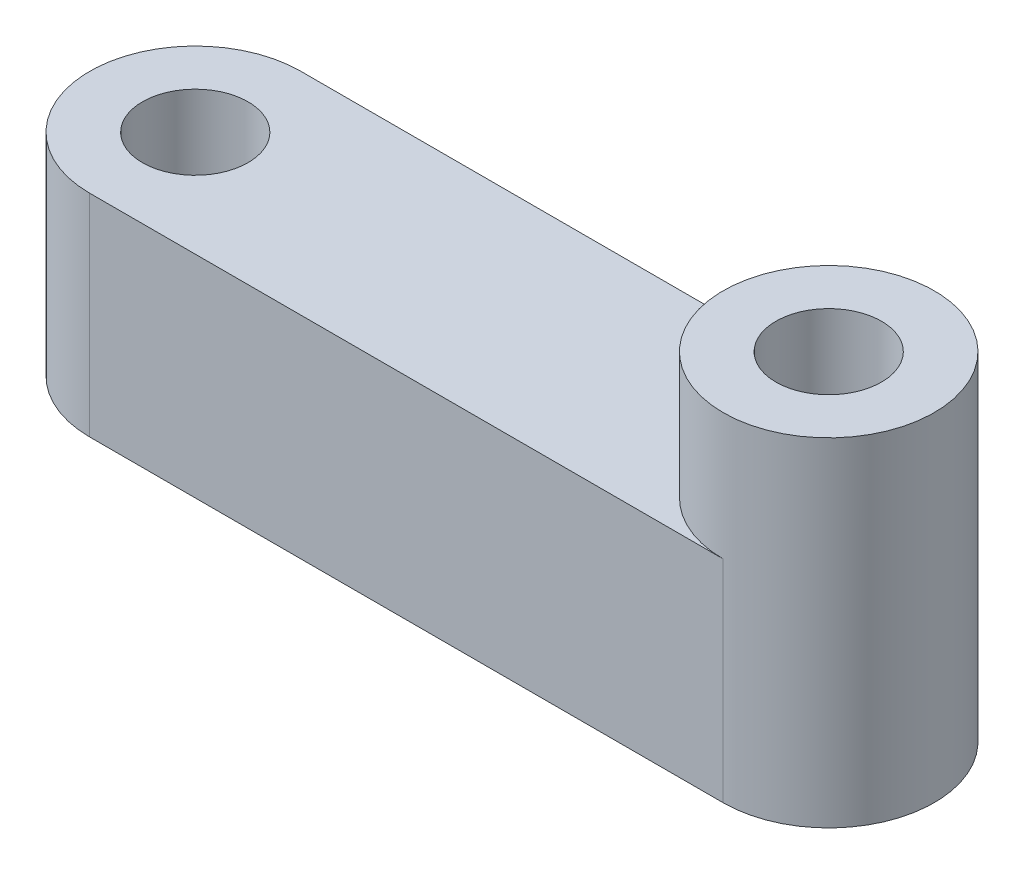
ISO-10303-21;
HEADER;
FILE_DESCRIPTION(('STEP AP214'),'2;1');
FILE_NAME('part.step','',(''),(''),'','','');
FILE_SCHEMA(('AUTOMOTIVE_DESIGN { 1 0 10303 214 1 1 1 1 }'));
ENDSEC;
DATA;
#1=APPLICATION_CONTEXT('core data for automotive mechanical design processes');
#2=APPLICATION_PROTOCOL_DEFINITION('international standard','automotive_design',2000,#1);
#3=PRODUCT_CONTEXT('',#1,'mechanical');
#4=PRODUCT('Part','Part','',(#3));
#5=PRODUCT_RELATED_PRODUCT_CATEGORY('part','',(#4));
#6=PRODUCT_DEFINITION_FORMATION('','',#4);
#7=PRODUCT_DEFINITION_CONTEXT('part definition',#1,'design');
#8=PRODUCT_DEFINITION('design','',#6,#7);
#9=PRODUCT_DEFINITION_SHAPE('','',#8);
#10=(LENGTH_UNIT() NAMED_UNIT(*) SI_UNIT(.MILLI.,.METRE.));
#11=(NAMED_UNIT(*) PLANE_ANGLE_UNIT() SI_UNIT($,.RADIAN.));
#12=(NAMED_UNIT(*) SI_UNIT($,.STERADIAN.) SOLID_ANGLE_UNIT());
#13=UNCERTAINTY_MEASURE_WITH_UNIT(LENGTH_MEASURE(1.E-05),#10,'distance_accuracy_value','');
#14=(GEOMETRIC_REPRESENTATION_CONTEXT(3) GLOBAL_UNCERTAINTY_ASSIGNED_CONTEXT((#13)) GLOBAL_UNIT_ASSIGNED_CONTEXT((#10,
#11,#12)) REPRESENTATION_CONTEXT('',''));
#15=CARTESIAN_POINT('',(0.,0.,0.));
#16=DIRECTION('',(0.,0.,1.));
#17=DIRECTION('',(1.,0.,0.));
#18=AXIS2_PLACEMENT_3D('',#15,#16,#17);
#19=CARTESIAN_POINT('',(0.,-6.,0.));
#20=DIRECTION('',(0.,1.,0.));
#21=DIRECTION('',(0.,0.,1.));
#22=AXIS2_PLACEMENT_3D('',#19,#20,#21);
#23=CYLINDRICAL_SURFACE('',#22,5.);
#24=DIRECTION('',(0.,1.,0.));
#25=VECTOR('',#24,1.);
#26=CARTESIAN_POINT('',(0.,-6.,5.));
#27=LINE('',#26,#25);
#28=CARTESIAN_POINT('',(0.,-6.,5.));
#29=VERTEX_POINT('',#28);
#30=CARTESIAN_POINT('',(0.,4.,5.));
#31=VERTEX_POINT('',#30);
#32=EDGE_CURVE('E92',#29,#31,#27,.T.);
#33=ORIENTED_EDGE('',*,*,#32,.T.);
#34=CARTESIAN_POINT('',(0.,4.,0.));
#35=DIRECTION('',(0.,1.,0.));
#36=DIRECTION('',(0.,0.,1.));
#37=AXIS2_PLACEMENT_3D('',#34,#35,#36);
#38=CIRCLE('',#37,5.);
#39=CARTESIAN_POINT('',(0.,4.,-5.));
#40=VERTEX_POINT('',#39);
#41=EDGE_CURVE('E81',#40,#31,#38,.T.);
#42=ORIENTED_EDGE('',*,*,#41,.F.);
#43=DIRECTION('',(0.,1.,0.));
#44=VECTOR('',#43,1.);
#45=CARTESIAN_POINT('',(0.,-6.,-5.));
#46=LINE('',#45,#44);
#47=CARTESIAN_POINT('',(0.,-6.,-5.));
#48=VERTEX_POINT('',#47);
#49=EDGE_CURVE('E41',#48,#40,#46,.T.);
#50=ORIENTED_EDGE('',*,*,#49,.F.);
#51=CARTESIAN_POINT('',(0.,-6.,0.));
#52=DIRECTION('',(0.,1.,0.));
#53=DIRECTION('',(0.,0.,1.));
#54=AXIS2_PLACEMENT_3D('',#51,#52,#53);
#55=CIRCLE('',#54,5.);
#56=EDGE_CURVE('E109',#48,#29,#55,.T.);
#57=ORIENTED_EDGE('',*,*,#56,.T.);
#58=EDGE_LOOP('',(#33,#42,#50,#57));
#59=FACE_BOUND('',#58,.T.);
#60=ADVANCED_FACE('F34',(#59),#23,.T.);
#61=CARTESIAN_POINT('',(0.,-6.,-5.));
#62=DIRECTION('',(0.,0.,-1.));
#63=DIRECTION('',(-1.,0.,0.));
#64=AXIS2_PLACEMENT_3D('',#61,#62,#63);
#65=PLANE('',#64);
#66=ORIENTED_EDGE('',*,*,#49,.T.);
#67=DIRECTION('',(-1.,0.,0.));
#68=VECTOR('',#67,1.);
#69=CARTESIAN_POINT('',(0.,4.,-5.));
#70=LINE('',#69,#68);
#71=CARTESIAN_POINT('',(30.,4.,-5.));
#72=VERTEX_POINT('',#71);
#73=EDGE_CURVE('E83',#72,#40,#70,.T.);
#74=ORIENTED_EDGE('',*,*,#73,.F.);
#75=DIRECTION('',(0.,1.,0.));
#76=VECTOR('',#75,1.);
#77=CARTESIAN_POINT('',(30.,-6.,-5.));
#78=LINE('',#77,#76);
#79=CARTESIAN_POINT('',(30.,-6.,-5.));
#80=VERTEX_POINT('',#79);
#81=EDGE_CURVE('E55',#80,#72,#78,.T.);
#82=ORIENTED_EDGE('',*,*,#81,.F.);
#83=DIRECTION('',(-1.,0.,0.));
#84=VECTOR('',#83,1.);
#85=CARTESIAN_POINT('',(0.,-6.,-5.));
#86=LINE('',#85,#84);
#87=EDGE_CURVE('E113',#80,#48,#86,.T.);
#88=ORIENTED_EDGE('',*,*,#87,.T.);
#89=EDGE_LOOP('',(#66,#74,#82,#88));
#90=FACE_BOUND('',#89,.T.);
#91=ADVANCED_FACE('F99',(#90),#65,.T.);
#92=CARTESIAN_POINT('',(30.,-6.,0.));
#93=DIRECTION('',(0.,1.,0.));
#94=DIRECTION('',(0.,0.,1.));
#95=AXIS2_PLACEMENT_3D('',#92,#93,#94);
#96=CYLINDRICAL_SURFACE('',#95,5.);
#97=ORIENTED_EDGE('',*,*,#81,.T.);
#98=CARTESIAN_POINT('',(30.,4.,0.));
#99=DIRECTION('',(0.,1.,0.));
#100=DIRECTION('',(0.,0.,1.));
#101=AXIS2_PLACEMENT_3D('',#98,#99,#100);
#102=CIRCLE('',#101,5.);
#103=CARTESIAN_POINT('',(30.,4.,5.));
#104=VERTEX_POINT('',#103);
#105=EDGE_CURVE('E11',#72,#104,#102,.T.);
#106=ORIENTED_EDGE('',*,*,#105,.T.);
#107=DIRECTION('',(0.,1.,0.));
#108=VECTOR('',#107,1.);
#109=CARTESIAN_POINT('',(30.,-6.,5.));
#110=LINE('',#109,#108);
#111=CARTESIAN_POINT('',(30.,-6.,5.));
#112=VERTEX_POINT('',#111);
#113=EDGE_CURVE('E86',#112,#104,#110,.T.);
#114=ORIENTED_EDGE('',*,*,#113,.F.);
#115=CARTESIAN_POINT('',(30.,-6.,0.));
#116=DIRECTION('',(0.,1.,0.));
#117=DIRECTION('',(0.,0.,1.));
#118=AXIS2_PLACEMENT_3D('',#115,#116,#117);
#119=CIRCLE('',#118,5.);
#120=EDGE_CURVE('E96',#112,#80,#119,.T.);
#121=ORIENTED_EDGE('',*,*,#120,.T.);
#122=EDGE_LOOP('',(#97,#106,#114,#121));
#123=FACE_BOUND('',#122,.T.);
#124=CARTESIAN_POINT('',(30.,10.,0.));
#125=DIRECTION('',(0.,1.,0.));
#126=DIRECTION('',(0.,0.,1.));
#127=AXIS2_PLACEMENT_3D('',#124,#125,#126);
#128=CIRCLE('',#127,5.);
#129=CARTESIAN_POINT('',(30.,10.,5.));
#130=VERTEX_POINT('',#129);
#131=EDGE_CURVE('E132',#130,#130,#128,.T.);
#132=ORIENTED_EDGE('',*,*,#131,.F.);
#133=EDGE_LOOP('',(#132));
#134=FACE_BOUND('',#133,.T.);
#135=ADVANCED_FACE('F94',(#123,#134),#96,.T.);
#136=CARTESIAN_POINT('',(0.,-6.,5.));
#137=DIRECTION('',(0.,0.,1.));
#138=DIRECTION('',(1.,0.,0.));
#139=AXIS2_PLACEMENT_3D('',#136,#137,#138);
#140=PLANE('',#139);
#141=ORIENTED_EDGE('',*,*,#113,.T.);
#142=DIRECTION('',(1.,0.,0.));
#143=VECTOR('',#142,1.);
#144=CARTESIAN_POINT('',(0.,4.,5.));
#145=LINE('',#144,#143);
#146=EDGE_CURVE('E76',#31,#104,#145,.T.);
#147=ORIENTED_EDGE('',*,*,#146,.F.);
#148=ORIENTED_EDGE('',*,*,#32,.F.);
#149=DIRECTION('',(1.,0.,0.));
#150=VECTOR('',#149,1.);
#151=CARTESIAN_POINT('',(0.,-6.,5.));
#152=LINE('',#151,#150);
#153=EDGE_CURVE('E89',#29,#112,#152,.T.);
#154=ORIENTED_EDGE('',*,*,#153,.T.);
#155=EDGE_LOOP('',(#141,#147,#148,#154));
#156=FACE_BOUND('',#155,.T.);
#157=ADVANCED_FACE('F87',(#156),#140,.T.);
#158=CARTESIAN_POINT('',(0.,-6.,0.));
#159=DIRECTION('',(0.,1.,0.));
#160=DIRECTION('',(0.,0.,1.));
#161=AXIS2_PLACEMENT_3D('',#158,#159,#160);
#162=PLANE('',#161);
#163=CARTESIAN_POINT('',(0.,-6.,0.));
#164=DIRECTION('',(0.,1.,0.));
#165=DIRECTION('',(0.,0.,1.));
#166=AXIS2_PLACEMENT_3D('',#163,#164,#165);
#167=CIRCLE('',#166,2.5);
#168=CARTESIAN_POINT('',(0.,-6.,2.5));
#169=VERTEX_POINT('',#168);
#170=EDGE_CURVE('E103',#169,#169,#167,.T.);
#171=ORIENTED_EDGE('',*,*,#170,.T.);
#172=EDGE_LOOP('',(#171));
#173=FACE_BOUND('',#172,.T.);
#174=ORIENTED_EDGE('',*,*,#87,.F.);
#175=ORIENTED_EDGE('',*,*,#120,.F.);
#176=ORIENTED_EDGE('',*,*,#153,.F.);
#177=ORIENTED_EDGE('',*,*,#56,.F.);
#178=EDGE_LOOP('',(#174,#175,#176,#177));
#179=FACE_BOUND('',#178,.T.);
#180=CARTESIAN_POINT('',(30.,-6.,0.));
#181=DIRECTION('',(0.,1.,0.));
#182=DIRECTION('',(0.,0.,1.));
#183=AXIS2_PLACEMENT_3D('',#180,#181,#182);
#184=CIRCLE('',#183,2.5);
#185=CARTESIAN_POINT('',(30.,-6.,2.5));
#186=VERTEX_POINT('',#185);
#187=EDGE_CURVE('E100',#186,#186,#184,.T.);
#188=ORIENTED_EDGE('',*,*,#187,.T.);
#189=EDGE_LOOP('',(#188));
#190=FACE_BOUND('',#189,.T.);
#191=ADVANCED_FACE('F116',(#173,#179,#190),#162,.F.);
#192=CARTESIAN_POINT('',(0.,-6.,0.));
#193=DIRECTION('',(0.,1.,0.));
#194=DIRECTION('',(0.,0.,1.));
#195=AXIS2_PLACEMENT_3D('',#192,#193,#194);
#196=CYLINDRICAL_SURFACE('',#195,2.5);
#197=ORIENTED_EDGE('',*,*,#170,.F.);
#198=EDGE_LOOP('',(#197));
#199=FACE_BOUND('',#198,.T.);
#200=CARTESIAN_POINT('',(0.,4.,0.));
#201=DIRECTION('',(0.,1.,0.));
#202=DIRECTION('',(0.,0.,1.));
#203=AXIS2_PLACEMENT_3D('',#200,#201,#202);
#204=CIRCLE('',#203,2.5);
#205=CARTESIAN_POINT('',(0.,4.,2.5));
#206=VERTEX_POINT('',#205);
#207=EDGE_CURVE('E135',#206,#206,#204,.T.);
#208=ORIENTED_EDGE('',*,*,#207,.T.);
#209=EDGE_LOOP('',(#208));
#210=FACE_BOUND('',#209,.T.);
#211=ADVANCED_FACE('F119',(#199,#210),#196,.F.);
#212=CARTESIAN_POINT('',(30.,-6.,0.));
#213=DIRECTION('',(0.,1.,0.));
#214=DIRECTION('',(0.,0.,1.));
#215=AXIS2_PLACEMENT_3D('',#212,#213,#214);
#216=CYLINDRICAL_SURFACE('',#215,2.5);
#217=ORIENTED_EDGE('',*,*,#187,.F.);
#218=EDGE_LOOP('',(#217));
#219=FACE_BOUND('',#218,.T.);
#220=CARTESIAN_POINT('',(30.,10.,0.));
#221=DIRECTION('',(0.,1.,0.));
#222=DIRECTION('',(0.,0.,1.));
#223=AXIS2_PLACEMENT_3D('',#220,#221,#222);
#224=CIRCLE('',#223,2.5);
#225=CARTESIAN_POINT('',(30.,10.,2.5));
#226=VERTEX_POINT('',#225);
#227=EDGE_CURVE('E130',#226,#226,#224,.T.);
#228=ORIENTED_EDGE('',*,*,#227,.T.);
#229=EDGE_LOOP('',(#228));
#230=FACE_BOUND('',#229,.T.);
#231=ADVANCED_FACE('F124',(#219,#230),#216,.F.);
#232=CARTESIAN_POINT('',(0.,4.,0.));
#233=DIRECTION('',(0.,1.,0.));
#234=DIRECTION('',(0.,0.,1.));
#235=AXIS2_PLACEMENT_3D('',#232,#233,#234);
#236=PLANE('',#235);
#237=ORIENTED_EDGE('',*,*,#105,.F.);
#238=ORIENTED_EDGE('',*,*,#73,.T.);
#239=ORIENTED_EDGE('',*,*,#41,.T.);
#240=ORIENTED_EDGE('',*,*,#146,.T.);
#241=EDGE_LOOP('',(#237,#238,#239,#240));
#242=FACE_BOUND('',#241,.T.);
#243=ORIENTED_EDGE('',*,*,#207,.F.);
#244=EDGE_LOOP('',(#243));
#245=FACE_BOUND('',#244,.T.);
#246=ADVANCED_FACE('F78',(#242,#245),#236,.T.);
#247=CARTESIAN_POINT('',(30.,10.,0.));
#248=DIRECTION('',(0.,1.,0.));
#249=DIRECTION('',(0.,0.,1.));
#250=AXIS2_PLACEMENT_3D('',#247,#248,#249);
#251=PLANE('',#250);
#252=ORIENTED_EDGE('',*,*,#131,.T.);
#253=EDGE_LOOP('',(#252));
#254=FACE_BOUND('',#253,.T.);
#255=ORIENTED_EDGE('',*,*,#227,.F.);
#256=EDGE_LOOP('',(#255));
#257=FACE_BOUND('',#256,.T.);
#258=ADVANCED_FACE('F142',(#254,#257),#251,.T.);
#259=CLOSED_SHELL('',(#60,#91,#135,#157,#191,#211,#231,#246,#258));
#260=MANIFOLD_SOLID_BREP('B2',#259);
#261=ADVANCED_BREP_SHAPE_REPRESENTATION('',(#18,#260),#14);
#262=SHAPE_DEFINITION_REPRESENTATION(#9,#261);
ENDSEC;
END-ISO-10303-21;
